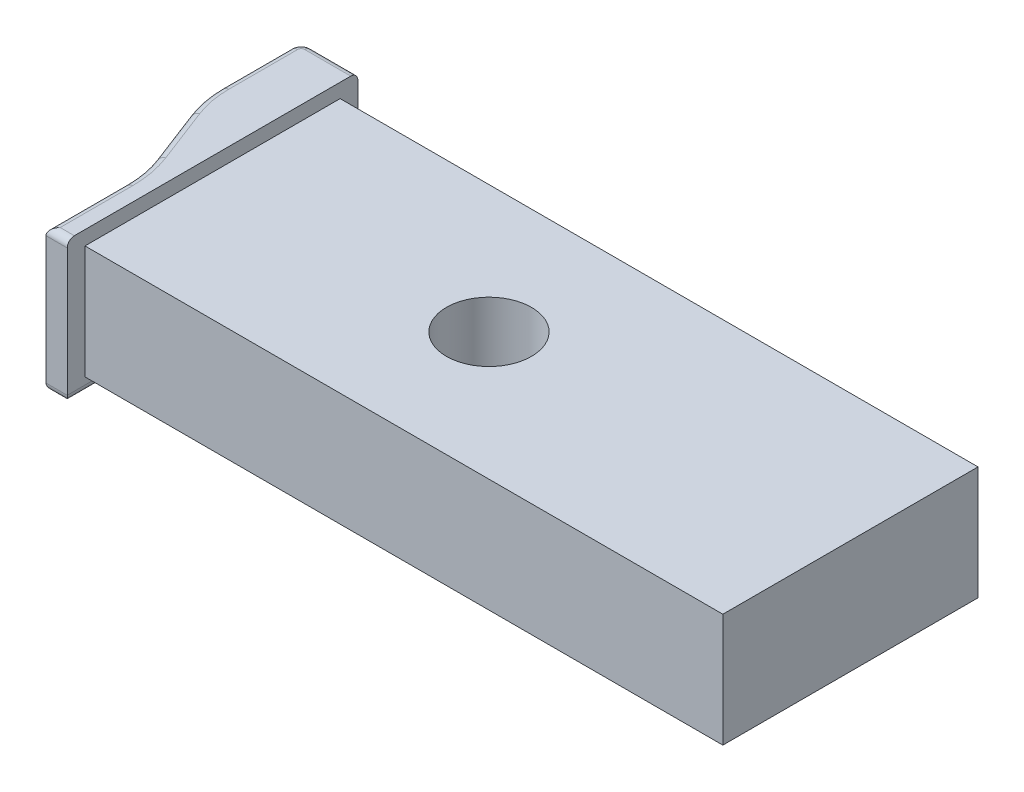
ISO-10303-21;
HEADER;
FILE_DESCRIPTION(('STEP AP214'),'2;1');
FILE_NAME('part.step','',(''),(''),'','','');
FILE_SCHEMA(('AUTOMOTIVE_DESIGN { 1 0 10303 214 1 1 1 1 }'));
ENDSEC;
DATA;
#1=APPLICATION_CONTEXT('core data for automotive mechanical design processes');
#2=APPLICATION_PROTOCOL_DEFINITION('international standard','automotive_design',2000,#1);
#3=PRODUCT_CONTEXT('',#1,'mechanical');
#4=PRODUCT('Part','Part','',(#3));
#5=PRODUCT_RELATED_PRODUCT_CATEGORY('part','',(#4));
#6=PRODUCT_DEFINITION_FORMATION('','',#4);
#7=PRODUCT_DEFINITION_CONTEXT('part definition',#1,'design');
#8=PRODUCT_DEFINITION('design','',#6,#7);
#9=PRODUCT_DEFINITION_SHAPE('','',#8);
#10=(LENGTH_UNIT() NAMED_UNIT(*) SI_UNIT(.MILLI.,.METRE.));
#11=(NAMED_UNIT(*) PLANE_ANGLE_UNIT() SI_UNIT($,.RADIAN.));
#12=(NAMED_UNIT(*) SI_UNIT($,.STERADIAN.) SOLID_ANGLE_UNIT());
#13=UNCERTAINTY_MEASURE_WITH_UNIT(LENGTH_MEASURE(1.E-05),#10,'distance_accuracy_value','');
#14=(GEOMETRIC_REPRESENTATION_CONTEXT(3) GLOBAL_UNCERTAINTY_ASSIGNED_CONTEXT((#13)) GLOBAL_UNIT_ASSIGNED_CONTEXT((#10,
#11,#12)) REPRESENTATION_CONTEXT('',''));
#15=CARTESIAN_POINT('',(0.,0.,0.));
#16=DIRECTION('',(0.,0.,1.));
#17=DIRECTION('',(1.,0.,0.));
#18=AXIS2_PLACEMENT_3D('',#15,#16,#17);
#19=CARTESIAN_POINT('',(0.,16.,0.));
#20=DIRECTION('',(0.,1.,0.));
#21=DIRECTION('',(0.,0.,1.));
#22=AXIS2_PLACEMENT_3D('',#19,#20,#21);
#23=PLANE('',#22);
#24=DIRECTION('',(0.,0.,-1.));
#25=VECTOR('',#24,1.);
#26=CARTESIAN_POINT('',(45.,16.,-18.));
#27=LINE('',#26,#25);
#28=CARTESIAN_POINT('',(45.,16.,18.));
#29=VERTEX_POINT('',#28);
#30=CARTESIAN_POINT('',(45.,16.,-18.));
#31=VERTEX_POINT('',#30);
#32=EDGE_CURVE('E219',#29,#31,#27,.T.);
#33=ORIENTED_EDGE('',*,*,#32,.T.);
#34=DIRECTION('',(-1.,0.,0.));
#35=VECTOR('',#34,1.);
#36=CARTESIAN_POINT('',(-45.,16.,-18.));
#37=LINE('',#36,#35);
#38=CARTESIAN_POINT('',(-45.,16.,-18.));
#39=VERTEX_POINT('',#38);
#40=EDGE_CURVE('E200',#31,#39,#37,.T.);
#41=ORIENTED_EDGE('',*,*,#40,.T.);
#42=DIRECTION('',(0.,0.,1.));
#43=VECTOR('',#42,1.);
#44=CARTESIAN_POINT('',(-45.,16.,-18.));
#45=LINE('',#44,#43);
#46=CARTESIAN_POINT('',(-45.,16.,18.));
#47=VERTEX_POINT('',#46);
#48=EDGE_CURVE('E185',#39,#47,#45,.T.);
#49=ORIENTED_EDGE('',*,*,#48,.T.);
#50=DIRECTION('',(1.,0.,0.));
#51=VECTOR('',#50,1.);
#52=CARTESIAN_POINT('',(-45.,16.,18.));
#53=LINE('',#52,#51);
#54=EDGE_CURVE('E198',#47,#29,#53,.T.);
#55=ORIENTED_EDGE('',*,*,#54,.T.);
#56=EDGE_LOOP('',(#33,#41,#49,#55));
#57=FACE_BOUND('',#56,.T.);
#58=CARTESIAN_POINT('',(-6.00000000000001,16.,0.));
#59=DIRECTION('',(0.,1.,0.));
#60=DIRECTION('',(0.,0.,1.));
#61=AXIS2_PLACEMENT_3D('',#58,#59,#60);
#62=CIRCLE('',#61,6.);
#63=CARTESIAN_POINT('',(-6.00000000000001,16.,6.));
#64=VERTEX_POINT('',#63);
#65=EDGE_CURVE('E214',#64,#64,#62,.T.);
#66=ORIENTED_EDGE('',*,*,#65,.F.);
#67=EDGE_LOOP('',(#66));
#68=FACE_BOUND('',#67,.T.);
#69=ADVANCED_FACE('F34',(#57,#68),#23,.T.);
#70=CARTESIAN_POINT('',(0.,0.,0.));
#71=DIRECTION('',(0.,1.,0.));
#72=DIRECTION('',(0.,0.,1.));
#73=AXIS2_PLACEMENT_3D('',#70,#71,#72);
#74=PLANE('',#73);
#75=DIRECTION('',(0.,0.,-1.));
#76=VECTOR('',#75,1.);
#77=CARTESIAN_POINT('',(45.,0.,-18.));
#78=LINE('',#77,#76);
#79=CARTESIAN_POINT('',(45.,0.,18.));
#80=VERTEX_POINT('',#79);
#81=CARTESIAN_POINT('',(45.,0.,-18.));
#82=VERTEX_POINT('',#81);
#83=EDGE_CURVE('E210',#80,#82,#78,.T.);
#84=ORIENTED_EDGE('',*,*,#83,.F.);
#85=DIRECTION('',(1.,0.,0.));
#86=VECTOR('',#85,1.);
#87=CARTESIAN_POINT('',(-45.,0.,18.));
#88=LINE('',#87,#86);
#89=CARTESIAN_POINT('',(-45.,0.,18.));
#90=VERTEX_POINT('',#89);
#91=EDGE_CURVE('E218',#90,#80,#88,.T.);
#92=ORIENTED_EDGE('',*,*,#91,.F.);
#93=DIRECTION('',(0.,0.,1.));
#94=VECTOR('',#93,1.);
#95=CARTESIAN_POINT('',(-45.,0.,-18.));
#96=LINE('',#95,#94);
#97=CARTESIAN_POINT('',(-45.,0.,-18.));
#98=VERTEX_POINT('',#97);
#99=EDGE_CURVE('E188',#98,#90,#96,.T.);
#100=ORIENTED_EDGE('',*,*,#99,.F.);
#101=DIRECTION('',(-1.,0.,0.));
#102=VECTOR('',#101,1.);
#103=CARTESIAN_POINT('',(-45.,0.,-18.));
#104=LINE('',#103,#102);
#105=EDGE_CURVE('E213',#82,#98,#104,.T.);
#106=ORIENTED_EDGE('',*,*,#105,.F.);
#107=EDGE_LOOP('',(#84,#92,#100,#106));
#108=FACE_BOUND('',#107,.T.);
#109=CARTESIAN_POINT('',(-6.00000000000001,0.,0.));
#110=DIRECTION('',(0.,1.,0.));
#111=DIRECTION('',(0.,0.,1.));
#112=AXIS2_PLACEMENT_3D('',#109,#110,#111);
#113=CIRCLE('',#112,6.);
#114=CARTESIAN_POINT('',(-6.00000000000001,0.,6.));
#115=VERTEX_POINT('',#114);
#116=EDGE_CURVE('E388',#115,#115,#113,.T.);
#117=ORIENTED_EDGE('',*,*,#116,.T.);
#118=EDGE_LOOP('',(#117));
#119=FACE_BOUND('',#118,.T.);
#120=ADVANCED_FACE('F399',(#108,#119),#74,.F.);
#121=CARTESIAN_POINT('',(45.,16.,-18.));
#122=DIRECTION('',(-1.,0.,0.));
#123=DIRECTION('',(0.,0.,1.));
#124=AXIS2_PLACEMENT_3D('',#121,#122,#123);
#125=PLANE('',#124);
#126=ORIENTED_EDGE('',*,*,#83,.T.);
#127=DIRECTION('',(0.,-1.,0.));
#128=VECTOR('',#127,1.);
#129=CARTESIAN_POINT('',(45.,16.,-18.));
#130=LINE('',#129,#128);
#131=EDGE_CURVE('E222',#31,#82,#130,.T.);
#132=ORIENTED_EDGE('',*,*,#131,.F.);
#133=ORIENTED_EDGE('',*,*,#32,.F.);
#134=DIRECTION('',(0.,-1.,0.));
#135=VECTOR('',#134,1.);
#136=CARTESIAN_POINT('',(45.,16.,18.));
#137=LINE('',#136,#135);
#138=EDGE_CURVE('E193',#29,#80,#137,.T.);
#139=ORIENTED_EDGE('',*,*,#138,.T.);
#140=EDGE_LOOP('',(#126,#132,#133,#139));
#141=FACE_BOUND('',#140,.T.);
#142=ADVANCED_FACE('F394',(#141),#125,.F.);
#143=CARTESIAN_POINT('',(-45.,16.,-18.));
#144=DIRECTION('',(0.,0.,1.));
#145=DIRECTION('',(1.,0.,0.));
#146=AXIS2_PLACEMENT_3D('',#143,#144,#145);
#147=PLANE('',#146);
#148=ORIENTED_EDGE('',*,*,#105,.T.);
#149=DIRECTION('',(0.,-1.,0.));
#150=VECTOR('',#149,1.);
#151=CARTESIAN_POINT('',(-45.,16.,-18.));
#152=LINE('',#151,#150);
#153=EDGE_CURVE('E192',#39,#98,#152,.T.);
#154=ORIENTED_EDGE('',*,*,#153,.F.);
#155=ORIENTED_EDGE('',*,*,#40,.F.);
#156=ORIENTED_EDGE('',*,*,#131,.T.);
#157=EDGE_LOOP('',(#148,#154,#155,#156));
#158=FACE_BOUND('',#157,.T.);
#159=ADVANCED_FACE('F397',(#158),#147,.F.);
#160=CARTESIAN_POINT('',(-45.,16.,18.));
#161=DIRECTION('',(0.,0.,-1.));
#162=DIRECTION('',(-1.,0.,0.));
#163=AXIS2_PLACEMENT_3D('',#160,#161,#162);
#164=PLANE('',#163);
#165=ORIENTED_EDGE('',*,*,#91,.T.);
#166=ORIENTED_EDGE('',*,*,#138,.F.);
#167=ORIENTED_EDGE('',*,*,#54,.F.);
#168=DIRECTION('',(0.,-1.,0.));
#169=VECTOR('',#168,1.);
#170=CARTESIAN_POINT('',(-45.,16.,18.));
#171=LINE('',#170,#169);
#172=EDGE_CURVE('E182',#47,#90,#171,.T.);
#173=ORIENTED_EDGE('',*,*,#172,.T.);
#174=EDGE_LOOP('',(#165,#166,#167,#173));
#175=FACE_BOUND('',#174,.T.);
#176=ADVANCED_FACE('F203',(#175),#164,.F.);
#177=CARTESIAN_POINT('',(-6.00000000000001,16.,0.));
#178=DIRECTION('',(0.,-1.,0.));
#179=DIRECTION('',(0.,0.,-1.));
#180=AXIS2_PLACEMENT_3D('',#177,#178,#179);
#181=CYLINDRICAL_SURFACE('',#180,6.);
#182=ORIENTED_EDGE('',*,*,#65,.T.);
#183=EDGE_LOOP('',(#182));
#184=FACE_BOUND('',#183,.T.);
#185=ORIENTED_EDGE('',*,*,#116,.F.);
#186=EDGE_LOOP('',(#185));
#187=FACE_BOUND('',#186,.T.);
#188=ADVANCED_FACE('F405',(#184,#187),#181,.F.);
#189=CARTESIAN_POINT('',(-45.,-2.,-20.5));
#190=DIRECTION('',(1.,0.,0.));
#191=DIRECTION('',(0.,0.,-1.));
#192=AXIS2_PLACEMENT_3D('',#189,#190,#191);
#193=PLANE('',#192);
#194=DIRECTION('',(0.,1.,0.));
#195=VECTOR('',#194,1.);
#196=CARTESIAN_POINT('',(-45.,-2.,20.5));
#197=LINE('',#196,#195);
#198=CARTESIAN_POINT('',(-45.,-0.999999999999998,20.5));
#199=VERTEX_POINT('',#198);
#200=CARTESIAN_POINT('',(-45.,17.,20.5));
#201=VERTEX_POINT('',#200);
#202=EDGE_CURVE('E721',#199,#201,#197,.T.);
#203=ORIENTED_EDGE('',*,*,#202,.F.);
#204=DIRECTION('',(0.,0.,-1.));
#205=VECTOR('',#204,1.);
#206=CARTESIAN_POINT('',(-45.,-0.999999999999998,-20.5));
#207=LINE('',#206,#205);
#208=CARTESIAN_POINT('',(-45.,-0.999999999999998,-20.5));
#209=VERTEX_POINT('',#208);
#210=EDGE_CURVE('E271',#199,#209,#207,.T.);
#211=ORIENTED_EDGE('',*,*,#210,.T.);
#212=DIRECTION('',(0.,1.,0.));
#213=VECTOR('',#212,1.);
#214=CARTESIAN_POINT('',(-45.,-2.,-20.5));
#215=LINE('',#214,#213);
#216=CARTESIAN_POINT('',(-45.,17.,-20.5));
#217=VERTEX_POINT('',#216);
#218=EDGE_CURVE('E391',#209,#217,#215,.T.);
#219=ORIENTED_EDGE('',*,*,#218,.T.);
#220=CARTESIAN_POINT('',(-45.,17.,-19.5));
#221=DIRECTION('',(1.,0.,0.));
#222=DIRECTION('',(0.,0.,-1.));
#223=AXIS2_PLACEMENT_3D('',#220,#221,#222);
#224=CIRCLE('',#223,1.);
#225=CARTESIAN_POINT('',(-45.,18.,-19.5));
#226=VERTEX_POINT('',#225);
#227=EDGE_CURVE('E242',#217,#226,#224,.T.);
#228=ORIENTED_EDGE('',*,*,#227,.T.);
#229=DIRECTION('',(0.,0.,-1.));
#230=VECTOR('',#229,1.);
#231=CARTESIAN_POINT('',(-45.,18.,-20.5));
#232=LINE('',#231,#230);
#233=CARTESIAN_POINT('',(-45.,18.,19.5));
#234=VERTEX_POINT('',#233);
#235=EDGE_CURVE('E293',#234,#226,#232,.T.);
#236=ORIENTED_EDGE('',*,*,#235,.F.);
#237=CARTESIAN_POINT('',(-45.,17.,19.5));
#238=DIRECTION('',(1.,0.,0.));
#239=DIRECTION('',(0.,0.,-1.));
#240=AXIS2_PLACEMENT_3D('',#237,#238,#239);
#241=CIRCLE('',#240,1.);
#242=EDGE_CURVE('E244',#234,#201,#241,.T.);
#243=ORIENTED_EDGE('',*,*,#242,.T.);
#244=EDGE_LOOP('',(#203,#211,#219,#228,#236,#243));
#245=FACE_BOUND('',#244,.T.);
#246=ORIENTED_EDGE('',*,*,#153,.T.);
#247=ORIENTED_EDGE('',*,*,#99,.T.);
#248=ORIENTED_EDGE('',*,*,#172,.F.);
#249=ORIENTED_EDGE('',*,*,#48,.F.);
#250=EDGE_LOOP('',(#246,#247,#248,#249));
#251=FACE_BOUND('',#250,.T.);
#252=ADVANCED_FACE('F184',(#245,#251),#193,.T.);
#253=CARTESIAN_POINT('',(-45.,-2.,-20.5));
#254=DIRECTION('',(0.,0.,-1.));
#255=DIRECTION('',(-1.,0.,0.));
#256=AXIS2_PLACEMENT_3D('',#253,#254,#255);
#257=PLANE('',#256);
#258=ORIENTED_EDGE('',*,*,#218,.F.);
#259=DIRECTION('',(-1.,0.,0.));
#260=VECTOR('',#259,1.);
#261=CARTESIAN_POINT('',(-45.,-0.999999999999998,-20.5));
#262=LINE('',#261,#260);
#263=CARTESIAN_POINT('',(-51.5,-0.999999999999998,-20.5));
#264=VERTEX_POINT('',#263);
#265=EDGE_CURVE('E11',#209,#264,#262,.T.);
#266=ORIENTED_EDGE('',*,*,#265,.T.);
#267=DIRECTION('',(0.,1.,0.));
#268=VECTOR('',#267,1.);
#269=CARTESIAN_POINT('',(-51.5,-2.,-20.5));
#270=LINE('',#269,#268);
#271=CARTESIAN_POINT('',(-51.5,17.,-20.5));
#272=VERTEX_POINT('',#271);
#273=EDGE_CURVE('E384',#264,#272,#270,.T.);
#274=ORIENTED_EDGE('',*,*,#273,.T.);
#275=DIRECTION('',(-1.,0.,0.));
#276=VECTOR('',#275,1.);
#277=CARTESIAN_POINT('',(-45.,17.,-20.5));
#278=LINE('',#277,#276);
#279=EDGE_CURVE('E268',#272,#217,#278,.F.);
#280=ORIENTED_EDGE('',*,*,#279,.T.);
#281=EDGE_LOOP('',(#258,#266,#274,#280));
#282=FACE_BOUND('',#281,.T.);
#283=ADVANCED_FACE('F413',(#282),#257,.T.);
#284=CARTESIAN_POINT('',(-45.,-2.,20.5));
#285=DIRECTION('',(0.,0.,1.));
#286=DIRECTION('',(1.,0.,0.));
#287=AXIS2_PLACEMENT_3D('',#284,#285,#286);
#288=PLANE('',#287);
#289=DIRECTION('',(0.,1.,0.));
#290=VECTOR('',#289,1.);
#291=CARTESIAN_POINT('',(-48.,-2.,20.5));
#292=LINE('',#291,#290);
#293=CARTESIAN_POINT('',(-48.,-0.999999999999998,20.5));
#294=VERTEX_POINT('',#293);
#295=CARTESIAN_POINT('',(-48.,17.,20.5));
#296=VERTEX_POINT('',#295);
#297=EDGE_CURVE('E375',#294,#296,#292,.T.);
#298=ORIENTED_EDGE('',*,*,#297,.F.);
#299=DIRECTION('',(1.,0.,0.));
#300=VECTOR('',#299,1.);
#301=CARTESIAN_POINT('',(-45.,-0.999999999999998,20.5));
#302=LINE('',#301,#300);
#303=EDGE_CURVE('E315',#294,#199,#302,.T.);
#304=ORIENTED_EDGE('',*,*,#303,.T.);
#305=ORIENTED_EDGE('',*,*,#202,.T.);
#306=DIRECTION('',(1.,0.,0.));
#307=VECTOR('',#306,1.);
#308=CARTESIAN_POINT('',(-48.,17.,20.5));
#309=LINE('',#308,#307);
#310=EDGE_CURVE('E247',#201,#296,#309,.F.);
#311=ORIENTED_EDGE('',*,*,#310,.T.);
#312=EDGE_LOOP('',(#298,#304,#305,#311));
#313=FACE_BOUND('',#312,.T.);
#314=ADVANCED_FACE('F583',(#313),#288,.T.);
#315=CARTESIAN_POINT('',(-48.,-2.,20.5));
#316=DIRECTION('',(-1.,0.,0.));
#317=DIRECTION('',(0.,0.,1.));
#318=AXIS2_PLACEMENT_3D('',#315,#316,#317);
#319=PLANE('',#318);
#320=DIRECTION('',(0.,1.,0.));
#321=VECTOR('',#320,1.);
#322=CARTESIAN_POINT('',(-48.,-2.,9.28516483155242));
#323=LINE('',#322,#321);
#324=CARTESIAN_POINT('',(-48.,-0.999999999999998,9.28516483155242));
#325=VERTEX_POINT('',#324);
#326=CARTESIAN_POINT('',(-48.,17.,9.28516483155242));
#327=VERTEX_POINT('',#326);
#328=EDGE_CURVE('E373',#325,#327,#323,.T.);
#329=ORIENTED_EDGE('',*,*,#328,.F.);
#330=DIRECTION('',(0.,0.,1.));
#331=VECTOR('',#330,1.);
#332=CARTESIAN_POINT('',(-48.,-0.999999999999998,20.5));
#333=LINE('',#332,#331);
#334=EDGE_CURVE('E317',#325,#294,#333,.T.);
#335=ORIENTED_EDGE('',*,*,#334,.T.);
#336=ORIENTED_EDGE('',*,*,#297,.T.);
#337=DIRECTION('',(0.,0.,1.));
#338=VECTOR('',#337,1.);
#339=CARTESIAN_POINT('',(-48.,17.,9.28516483155242));
#340=LINE('',#339,#338);
#341=EDGE_CURVE('E250',#296,#327,#340,.F.);
#342=ORIENTED_EDGE('',*,*,#341,.T.);
#343=EDGE_LOOP('',(#329,#335,#336,#342));
#344=FACE_BOUND('',#343,.T.);
#345=ADVANCED_FACE('F576',(#344),#319,.T.);
#346=CARTESIAN_POINT('',(-63.,-2.,9.28516483155236));
#347=DIRECTION('',(0.,1.,0.));
#348=DIRECTION('',(0.,0.,1.));
#349=AXIS2_PLACEMENT_3D('',#346,#347,#348);
#350=CYLINDRICAL_SURFACE('',#349,15.);
#351=DIRECTION('',(0.,1.,0.));
#352=VECTOR('',#351,1.);
#353=CARTESIAN_POINT('',(-48.9998159069541,-2.,3.90047864191927));
#354=LINE('',#353,#352);
#355=CARTESIAN_POINT('',(-48.9998159069541,-0.999999999999998,3.90047864191927));
#356=VERTEX_POINT('',#355);
#357=CARTESIAN_POINT('',(-48.9998159069541,17.,3.90047864191927));
#358=VERTEX_POINT('',#357);
#359=EDGE_CURVE('E366',#356,#358,#354,.T.);
#360=ORIENTED_EDGE('',*,*,#359,.F.);
#361=CARTESIAN_POINT('',(-63.,-0.999999999999998,9.28516483155236));
#362=DIRECTION('',(0.,-1.,0.));
#363=DIRECTION('',(0.,0.,-1.));
#364=AXIS2_PLACEMENT_3D('',#361,#362,#363);
#365=CIRCLE('',#364,15.);
#366=EDGE_CURVE('E319',#356,#325,#365,.T.);
#367=ORIENTED_EDGE('',*,*,#366,.T.);
#368=ORIENTED_EDGE('',*,*,#328,.T.);
#369=CARTESIAN_POINT('',(-63.,17.,9.28516483155236));
#370=DIRECTION('',(0.,-1.,0.));
#371=DIRECTION('',(0.,0.,-1.));
#372=AXIS2_PLACEMENT_3D('',#369,#370,#371);
#373=CIRCLE('',#372,15.);
#374=EDGE_CURVE('E253',#327,#358,#373,.F.);
#375=ORIENTED_EDGE('',*,*,#374,.T.);
#376=EDGE_LOOP('',(#360,#367,#368,#375));
#377=FACE_BOUND('',#376,.T.);
#378=ADVANCED_FACE('F369',(#377),#350,.F.);
#379=CARTESIAN_POINT('',(-52.0001840930459,-2.,-3.90047864191927));
#380=DIRECTION('',(-0.93334560620306,0.,0.358979079308869));
#381=DIRECTION('',(0.358979079308869,0.,0.93334560620306));
#382=AXIS2_PLACEMENT_3D('',#379,#380,#381);
#383=PLANE('',#382);
#384=DIRECTION('',(0.,1.,0.));
#385=VECTOR('',#384,1.);
#386=CARTESIAN_POINT('',(-52.0001840930459,-2.,-3.90047864191927));
#387=LINE('',#386,#385);
#388=CARTESIAN_POINT('',(-52.0001840930459,-0.999999999999998,-3.90047864191927));
#389=VERTEX_POINT('',#388);
#390=CARTESIAN_POINT('',(-52.0001840930459,17.,-3.90047864191927));
#391=VERTEX_POINT('',#390);
#392=EDGE_CURVE('E367',#389,#391,#387,.T.);
#393=ORIENTED_EDGE('',*,*,#392,.F.);
#394=DIRECTION('',(0.358979079308869,0.,0.93334560620306));
#395=VECTOR('',#394,1.);
#396=CARTESIAN_POINT('',(-52.0001840930459,-0.999999999999998,-3.90047864191927));
#397=LINE('',#396,#395);
#398=EDGE_CURVE('E321',#389,#356,#397,.T.);
#399=ORIENTED_EDGE('',*,*,#398,.T.);
#400=ORIENTED_EDGE('',*,*,#359,.T.);
#401=DIRECTION('',(0.358979079308869,0.,0.93334560620306));
#402=VECTOR('',#401,1.);
#403=CARTESIAN_POINT('',(-52.0001840930459,17.,-3.90047864191927));
#404=LINE('',#403,#402);
#405=EDGE_CURVE('E256',#358,#391,#404,.F.);
#406=ORIENTED_EDGE('',*,*,#405,.T.);
#407=EDGE_LOOP('',(#393,#399,#400,#406));
#408=FACE_BOUND('',#407,.T.);
#409=ADVANCED_FACE('F365',(#408),#383,.T.);
#410=CARTESIAN_POINT('',(-38.,-2.,-9.28516483155236));
#411=DIRECTION('',(0.,1.,0.));
#412=DIRECTION('',(0.,0.,1.));
#413=AXIS2_PLACEMENT_3D('',#410,#411,#412);
#414=CYLINDRICAL_SURFACE('',#413,15.);
#415=DIRECTION('',(0.,1.,0.));
#416=VECTOR('',#415,1.);
#417=CARTESIAN_POINT('',(-53.,-2.,-9.28516483155241));
#418=LINE('',#417,#416);
#419=CARTESIAN_POINT('',(-53.,-0.999999999999998,-9.28516483155241));
#420=VERTEX_POINT('',#419);
#421=CARTESIAN_POINT('',(-53.,17.,-9.28516483155241));
#422=VERTEX_POINT('',#421);
#423=EDGE_CURVE('E377',#420,#422,#418,.T.);
#424=ORIENTED_EDGE('',*,*,#423,.F.);
#425=CARTESIAN_POINT('',(-38.,-0.999999999999998,-9.28516483155236));
#426=DIRECTION('',(0.,-1.,0.));
#427=DIRECTION('',(0.,0.,-1.));
#428=AXIS2_PLACEMENT_3D('',#425,#426,#427);
#429=CIRCLE('',#428,15.);
#430=EDGE_CURVE('E323',#420,#389,#429,.F.);
#431=ORIENTED_EDGE('',*,*,#430,.T.);
#432=ORIENTED_EDGE('',*,*,#392,.T.);
#433=CARTESIAN_POINT('',(-38.,17.,-9.28516483155236));
#434=DIRECTION('',(0.,-1.,0.));
#435=DIRECTION('',(0.,0.,-1.));
#436=AXIS2_PLACEMENT_3D('',#433,#434,#435);
#437=CIRCLE('',#436,15.);
#438=EDGE_CURVE('E259',#391,#422,#437,.T.);
#439=ORIENTED_EDGE('',*,*,#438,.T.);
#440=EDGE_LOOP('',(#424,#431,#432,#439));
#441=FACE_BOUND('',#440,.T.);
#442=ADVANCED_FACE('F555',(#441),#414,.T.);
#443=CARTESIAN_POINT('',(-53.,-2.,-19.));
#444=DIRECTION('',(-1.,0.,0.));
#445=DIRECTION('',(0.,0.,1.));
#446=AXIS2_PLACEMENT_3D('',#443,#444,#445);
#447=PLANE('',#446);
#448=DIRECTION('',(0.,1.,0.));
#449=VECTOR('',#448,1.);
#450=CARTESIAN_POINT('',(-53.,-2.,-19.));
#451=LINE('',#450,#449);
#452=CARTESIAN_POINT('',(-53.,-0.999999999999998,-19.));
#453=VERTEX_POINT('',#452);
#454=CARTESIAN_POINT('',(-53.,17.,-19.));
#455=VERTEX_POINT('',#454);
#456=EDGE_CURVE('E382',#453,#455,#451,.T.);
#457=ORIENTED_EDGE('',*,*,#456,.F.);
#458=DIRECTION('',(0.,0.,1.));
#459=VECTOR('',#458,1.);
#460=CARTESIAN_POINT('',(-53.,-0.999999999999998,-19.));
#461=LINE('',#460,#459);
#462=EDGE_CURVE('E325',#453,#420,#461,.T.);
#463=ORIENTED_EDGE('',*,*,#462,.T.);
#464=ORIENTED_EDGE('',*,*,#423,.T.);
#465=DIRECTION('',(0.,0.,1.));
#466=VECTOR('',#465,1.);
#467=CARTESIAN_POINT('',(-53.,17.,-19.));
#468=LINE('',#467,#466);
#469=EDGE_CURVE('E262',#422,#455,#468,.F.);
#470=ORIENTED_EDGE('',*,*,#469,.T.);
#471=EDGE_LOOP('',(#457,#463,#464,#470));
#472=FACE_BOUND('',#471,.T.);
#473=ADVANCED_FACE('F548',(#472),#447,.T.);
#474=CARTESIAN_POINT('',(-51.5,-2.,-19.));
#475=DIRECTION('',(0.,1.,0.));
#476=DIRECTION('',(0.,0.,1.));
#477=AXIS2_PLACEMENT_3D('',#474,#475,#476);
#478=CYLINDRICAL_SURFACE('',#477,1.5);
#479=ORIENTED_EDGE('',*,*,#273,.F.);
#480=CARTESIAN_POINT('',(-51.5,-0.999999999999998,-19.));
#481=DIRECTION('',(0.,-1.,0.));
#482=DIRECTION('',(0.,0.,-1.));
#483=AXIS2_PLACEMENT_3D('',#480,#481,#482);
#484=CIRCLE('',#483,1.5);
#485=EDGE_CURVE('E43',#264,#453,#484,.F.);
#486=ORIENTED_EDGE('',*,*,#485,.T.);
#487=ORIENTED_EDGE('',*,*,#456,.T.);
#488=CARTESIAN_POINT('',(-51.5,17.,-19.));
#489=DIRECTION('',(0.,-1.,0.));
#490=DIRECTION('',(0.,0.,-1.));
#491=AXIS2_PLACEMENT_3D('',#488,#489,#490);
#492=CIRCLE('',#491,1.5);
#493=EDGE_CURVE('E265',#455,#272,#492,.T.);
#494=ORIENTED_EDGE('',*,*,#493,.T.);
#495=EDGE_LOOP('',(#479,#486,#487,#494));
#496=FACE_BOUND('',#495,.T.);
#497=ADVANCED_FACE('F540',(#496),#478,.T.);
#498=CARTESIAN_POINT('',(-51.5,-2.,-19.));
#499=DIRECTION('',(0.,-1.,0.));
#500=DIRECTION('',(0.,0.,-1.));
#501=AXIS2_PLACEMENT_3D('',#498,#499,#500);
#502=PLANE('',#501);
#503=DIRECTION('',(-1.,0.,0.));
#504=VECTOR('',#503,1.);
#505=CARTESIAN_POINT('',(-51.5,-2.,-19.5));
#506=LINE('',#505,#504);
#507=CARTESIAN_POINT('',(-51.5,-2.,-19.5));
#508=VERTEX_POINT('',#507);
#509=CARTESIAN_POINT('',(-46.,-2.,-19.5));
#510=VERTEX_POINT('',#509);
#511=EDGE_CURVE('E296',#508,#510,#506,.F.);
#512=ORIENTED_EDGE('',*,*,#511,.T.);
#513=DIRECTION('',(0.,0.,-1.));
#514=VECTOR('',#513,1.);
#515=CARTESIAN_POINT('',(-46.,-2.,-19.));
#516=LINE('',#515,#514);
#517=CARTESIAN_POINT('',(-46.,-2.,19.5));
#518=VERTEX_POINT('',#517);
#519=EDGE_CURVE('E312',#510,#518,#516,.F.);
#520=ORIENTED_EDGE('',*,*,#519,.T.);
#521=DIRECTION('',(1.,0.,0.));
#522=VECTOR('',#521,1.);
#523=CARTESIAN_POINT('',(-51.5,-2.,19.5));
#524=LINE('',#523,#522);
#525=CARTESIAN_POINT('',(-47.,-2.,19.5));
#526=VERTEX_POINT('',#525);
#527=EDGE_CURVE('E310',#518,#526,#524,.F.);
#528=ORIENTED_EDGE('',*,*,#527,.T.);
#529=DIRECTION('',(0.,0.,1.));
#530=VECTOR('',#529,1.);
#531=CARTESIAN_POINT('',(-47.,-2.,-19.));
#532=LINE('',#531,#530);
#533=CARTESIAN_POINT('',(-47.,-2.,9.28516483155242));
#534=VERTEX_POINT('',#533);
#535=EDGE_CURVE('E308',#526,#534,#532,.F.);
#536=ORIENTED_EDGE('',*,*,#535,.T.);
#537=CARTESIAN_POINT('',(-63.,-2.,9.28516483155236));
#538=DIRECTION('',(0.,-1.,0.));
#539=DIRECTION('',(0.,0.,-1.));
#540=AXIS2_PLACEMENT_3D('',#537,#538,#539);
#541=CIRCLE('',#540,16.);
#542=CARTESIAN_POINT('',(-48.0664703007511,-2.,3.5414995626104));
#543=VERTEX_POINT('',#542);
#544=EDGE_CURVE('E306',#534,#543,#541,.F.);
#545=ORIENTED_EDGE('',*,*,#544,.T.);
#546=DIRECTION('',(0.358979079308869,0.,0.93334560620306));
#547=VECTOR('',#546,1.);
#548=CARTESIAN_POINT('',(-56.0614997546217,-2.,-17.2455770174532));
#549=LINE('',#548,#547);
#550=CARTESIAN_POINT('',(-51.0668384868428,-2.,-4.25945772122814));
#551=VERTEX_POINT('',#550);
#552=EDGE_CURVE('E304',#543,#551,#549,.F.);
#553=ORIENTED_EDGE('',*,*,#552,.T.);
#554=CARTESIAN_POINT('',(-38.,-2.,-9.28516483155236));
#555=DIRECTION('',(0.,-1.,0.));
#556=DIRECTION('',(0.,0.,-1.));
#557=AXIS2_PLACEMENT_3D('',#554,#555,#556);
#558=CIRCLE('',#557,14.);
#559=CARTESIAN_POINT('',(-52.,-2.,-9.28516483155241));
#560=VERTEX_POINT('',#559);
#561=EDGE_CURVE('E302',#551,#560,#558,.T.);
#562=ORIENTED_EDGE('',*,*,#561,.T.);
#563=DIRECTION('',(0.,0.,1.));
#564=VECTOR('',#563,1.);
#565=CARTESIAN_POINT('',(-52.,-2.,-19.));
#566=LINE('',#565,#564);
#567=CARTESIAN_POINT('',(-52.,-2.,-19.));
#568=VERTEX_POINT('',#567);
#569=EDGE_CURVE('E300',#560,#568,#566,.F.);
#570=ORIENTED_EDGE('',*,*,#569,.T.);
#571=CARTESIAN_POINT('',(-51.5,-2.,-19.));
#572=DIRECTION('',(0.,-1.,0.));
#573=DIRECTION('',(0.,0.,-1.));
#574=AXIS2_PLACEMENT_3D('',#571,#572,#573);
#575=CIRCLE('',#574,0.500000000000001);
#576=EDGE_CURVE('E298',#568,#508,#575,.T.);
#577=ORIENTED_EDGE('',*,*,#576,.T.);
#578=EDGE_LOOP('',(#512,#520,#528,#536,#545,#553,#562,#570,#577));
#579=FACE_BOUND('',#578,.T.);
#580=ADVANCED_FACE('F532',(#579),#502,.T.);
#581=CARTESIAN_POINT('',(-51.5,18.,-19.));
#582=DIRECTION('',(0.,-1.,0.));
#583=DIRECTION('',(0.,0.,-1.));
#584=AXIS2_PLACEMENT_3D('',#581,#582,#583);
#585=PLANE('',#584);
#586=DIRECTION('',(0.,0.,1.));
#587=VECTOR('',#586,1.);
#588=CARTESIAN_POINT('',(-47.,18.,20.5));
#589=LINE('',#588,#587);
#590=CARTESIAN_POINT('',(-47.,18.,9.28516483155242));
#591=VERTEX_POINT('',#590);
#592=CARTESIAN_POINT('',(-47.,18.,19.5));
#593=VERTEX_POINT('',#592);
#594=EDGE_CURVE('E237',#591,#593,#589,.T.);
#595=ORIENTED_EDGE('',*,*,#594,.T.);
#596=DIRECTION('',(1.,0.,0.));
#597=VECTOR('',#596,1.);
#598=CARTESIAN_POINT('',(-45.,18.,19.5));
#599=LINE('',#598,#597);
#600=EDGE_CURVE('E239',#593,#234,#599,.T.);
#601=ORIENTED_EDGE('',*,*,#600,.T.);
#602=ORIENTED_EDGE('',*,*,#235,.T.);
#603=DIRECTION('',(-1.,0.,0.));
#604=VECTOR('',#603,1.);
#605=CARTESIAN_POINT('',(-51.5,18.,-19.5));
#606=LINE('',#605,#604);
#607=CARTESIAN_POINT('',(-51.5,18.,-19.5));
#608=VERTEX_POINT('',#607);
#609=EDGE_CURVE('E225',#226,#608,#606,.T.);
#610=ORIENTED_EDGE('',*,*,#609,.T.);
#611=CARTESIAN_POINT('',(-51.5,18.,-19.));
#612=DIRECTION('',(0.,-1.,0.));
#613=DIRECTION('',(0.,0.,-1.));
#614=AXIS2_PLACEMENT_3D('',#611,#612,#613);
#615=CIRCLE('',#614,0.500000000000001);
#616=CARTESIAN_POINT('',(-52.,18.,-19.));
#617=VERTEX_POINT('',#616);
#618=EDGE_CURVE('E227',#608,#617,#615,.F.);
#619=ORIENTED_EDGE('',*,*,#618,.T.);
#620=DIRECTION('',(0.,0.,1.));
#621=VECTOR('',#620,1.);
#622=CARTESIAN_POINT('',(-52.,18.,-9.28516483155241));
#623=LINE('',#622,#621);
#624=CARTESIAN_POINT('',(-52.,18.,-9.28516483155241));
#625=VERTEX_POINT('',#624);
#626=EDGE_CURVE('E229',#617,#625,#623,.T.);
#627=ORIENTED_EDGE('',*,*,#626,.T.);
#628=CARTESIAN_POINT('',(-38.,18.,-9.28516483155236));
#629=DIRECTION('',(0.,-1.,0.));
#630=DIRECTION('',(0.,0.,-1.));
#631=AXIS2_PLACEMENT_3D('',#628,#629,#630);
#632=CIRCLE('',#631,14.);
#633=CARTESIAN_POINT('',(-51.0668384868428,18.,-4.25945772122814));
#634=VERTEX_POINT('',#633);
#635=EDGE_CURVE('E231',#625,#634,#632,.F.);
#636=ORIENTED_EDGE('',*,*,#635,.T.);
#637=DIRECTION('',(0.358979079308869,0.,0.93334560620306));
#638=VECTOR('',#637,1.);
#639=CARTESIAN_POINT('',(-48.066470300751,18.,3.54149956261041));
#640=LINE('',#639,#638);
#641=CARTESIAN_POINT('',(-48.0664703007511,18.,3.54149956261039));
#642=VERTEX_POINT('',#641);
#643=EDGE_CURVE('E233',#634,#642,#640,.T.);
#644=ORIENTED_EDGE('',*,*,#643,.T.);
#645=CARTESIAN_POINT('',(-63.,18.,9.28516483155236));
#646=DIRECTION('',(0.,-1.,0.));
#647=DIRECTION('',(0.,0.,-1.));
#648=AXIS2_PLACEMENT_3D('',#645,#646,#647);
#649=CIRCLE('',#648,16.);
#650=EDGE_CURVE('E235',#642,#591,#649,.T.);
#651=ORIENTED_EDGE('',*,*,#650,.T.);
#652=EDGE_LOOP('',(#595,#601,#602,#610,#619,#627,#636,#644,#651));
#653=FACE_BOUND('',#652,.T.);
#654=ADVANCED_FACE('F458',(#653),#585,.F.);
#655=CARTESIAN_POINT('',(-51.5,17.,-19.5));
#656=DIRECTION('',(1.,0.,0.));
#657=DIRECTION('',(0.,0.,-1.));
#658=AXIS2_PLACEMENT_3D('',#655,#656,#657);
#659=CYLINDRICAL_SURFACE('',#658,1.);
#660=ORIENTED_EDGE('',*,*,#227,.F.);
#661=ORIENTED_EDGE('',*,*,#279,.F.);
#662=CARTESIAN_POINT('',(-51.5,17.,-19.5));
#663=DIRECTION('',(-1.,0.,0.));
#664=DIRECTION('',(0.,0.,1.));
#665=AXIS2_PLACEMENT_3D('',#662,#663,#664);
#666=CIRCLE('',#665,1.);
#667=EDGE_CURVE('E290',#608,#272,#666,.T.);
#668=ORIENTED_EDGE('',*,*,#667,.F.);
#669=ORIENTED_EDGE('',*,*,#609,.F.);
#670=EDGE_LOOP('',(#660,#661,#668,#669));
#671=FACE_BOUND('',#670,.T.);
#672=ADVANCED_FACE('F454',(#671),#659,.T.);
#673=CARTESIAN_POINT('',(-51.5,17.,-19.));
#674=DIRECTION('',(0.,-1.,0.));
#675=DIRECTION('',(0.,0.,-1.));
#676=AXIS2_PLACEMENT_3D('',#673,#674,#675);
#677=DEGENERATE_TOROIDAL_SURFACE('',#676,0.500000000000001,1.,.T.);
#678=ORIENTED_EDGE('',*,*,#667,.T.);
#679=ORIENTED_EDGE('',*,*,#493,.F.);
#680=CARTESIAN_POINT('',(-52.,17.,-19.));
#681=DIRECTION('',(0.,0.,1.));
#682=DIRECTION('',(1.,0.,0.));
#683=AXIS2_PLACEMENT_3D('',#680,#681,#682);
#684=CIRCLE('',#683,1.);
#685=EDGE_CURVE('E287',#617,#455,#684,.T.);
#686=ORIENTED_EDGE('',*,*,#685,.F.);
#687=ORIENTED_EDGE('',*,*,#618,.F.);
#688=EDGE_LOOP('',(#678,#679,#686,#687));
#689=FACE_BOUND('',#688,.T.);
#690=ADVANCED_FACE('F450',(#689),#677,.T.);
#691=CARTESIAN_POINT('',(-52.,17.,-19.));
#692=DIRECTION('',(0.,0.,-1.));
#693=DIRECTION('',(-1.,0.,0.));
#694=AXIS2_PLACEMENT_3D('',#691,#692,#693);
#695=CYLINDRICAL_SURFACE('',#694,1.);
#696=ORIENTED_EDGE('',*,*,#685,.T.);
#697=ORIENTED_EDGE('',*,*,#469,.F.);
#698=CARTESIAN_POINT('',(-52.,17.,-9.28516483155241));
#699=DIRECTION('',(0.,0.,1.));
#700=DIRECTION('',(1.,0.,0.));
#701=AXIS2_PLACEMENT_3D('',#698,#699,#700);
#702=CIRCLE('',#701,1.);
#703=EDGE_CURVE('E284',#625,#422,#702,.T.);
#704=ORIENTED_EDGE('',*,*,#703,.F.);
#705=ORIENTED_EDGE('',*,*,#626,.F.);
#706=EDGE_LOOP('',(#696,#697,#704,#705));
#707=FACE_BOUND('',#706,.T.);
#708=ADVANCED_FACE('F446',(#707),#695,.T.);
#709=CARTESIAN_POINT('',(-38.,17.,-9.28516483155236));
#710=DIRECTION('',(0.,-1.,0.));
#711=DIRECTION('',(0.,0.,-1.));
#712=AXIS2_PLACEMENT_3D('',#709,#710,#711);
#713=TOROIDAL_SURFACE('',#712,14.,1.);
#714=ORIENTED_EDGE('',*,*,#703,.T.);
#715=ORIENTED_EDGE('',*,*,#438,.F.);
#716=CARTESIAN_POINT('',(-51.0668384868428,17.,-4.25945772122814));
#717=DIRECTION('',(0.358979079308869,0.,0.93334560620306));
#718=DIRECTION('',(0.93334560620306,0.,-0.358979079308869));
#719=AXIS2_PLACEMENT_3D('',#716,#717,#718);
#720=CIRCLE('',#719,1.);
#721=EDGE_CURVE('E281',#634,#391,#720,.T.);
#722=ORIENTED_EDGE('',*,*,#721,.F.);
#723=ORIENTED_EDGE('',*,*,#635,.F.);
#724=EDGE_LOOP('',(#714,#715,#722,#723));
#725=FACE_BOUND('',#724,.T.);
#726=ADVANCED_FACE('F442',(#725),#713,.T.);
#727=CARTESIAN_POINT('',(-56.0614997546217,17.,-17.2455770174532));
#728=DIRECTION('',(-0.358979079308869,0.,-0.93334560620306));
#729=DIRECTION('',(-0.93334560620306,0.,0.358979079308869));
#730=AXIS2_PLACEMENT_3D('',#727,#728,#729);
#731=CYLINDRICAL_SURFACE('',#730,1.);
#732=ORIENTED_EDGE('',*,*,#721,.T.);
#733=ORIENTED_EDGE('',*,*,#405,.F.);
#734=CARTESIAN_POINT('',(-48.0664703007511,17.,3.54149956261039));
#735=DIRECTION('',(0.358979079308874,0.,0.933345606203058));
#736=DIRECTION('',(0.933345606203058,0.,-0.358979079308874));
#737=AXIS2_PLACEMENT_3D('',#734,#735,#736);
#738=CIRCLE('',#737,1.);
#739=EDGE_CURVE('E278',#642,#358,#738,.T.);
#740=ORIENTED_EDGE('',*,*,#739,.F.);
#741=ORIENTED_EDGE('',*,*,#643,.F.);
#742=EDGE_LOOP('',(#732,#733,#740,#741));
#743=FACE_BOUND('',#742,.T.);
#744=ADVANCED_FACE('F438',(#743),#731,.T.);
#745=CARTESIAN_POINT('',(-63.,17.,9.28516483155236));
#746=DIRECTION('',(0.,-1.,0.));
#747=DIRECTION('',(0.,0.,-1.));
#748=AXIS2_PLACEMENT_3D('',#745,#746,#747);
#749=TOROIDAL_SURFACE('',#748,16.,1.);
#750=ORIENTED_EDGE('',*,*,#739,.T.);
#751=ORIENTED_EDGE('',*,*,#374,.F.);
#752=CARTESIAN_POINT('',(-47.,17.,9.28516483155242));
#753=DIRECTION('',(0.,0.,1.));
#754=DIRECTION('',(1.,0.,0.));
#755=AXIS2_PLACEMENT_3D('',#752,#753,#754);
#756=CIRCLE('',#755,1.);
#757=EDGE_CURVE('E275',#591,#327,#756,.T.);
#758=ORIENTED_EDGE('',*,*,#757,.F.);
#759=ORIENTED_EDGE('',*,*,#650,.F.);
#760=EDGE_LOOP('',(#750,#751,#758,#759));
#761=FACE_BOUND('',#760,.T.);
#762=ADVANCED_FACE('F434',(#761),#749,.T.);
#763=CARTESIAN_POINT('',(-47.,17.,-19.));
#764=DIRECTION('',(0.,0.,-1.));
#765=DIRECTION('',(-1.,0.,0.));
#766=AXIS2_PLACEMENT_3D('',#763,#764,#765);
#767=CYLINDRICAL_SURFACE('',#766,1.);
#768=ORIENTED_EDGE('',*,*,#757,.T.);
#769=ORIENTED_EDGE('',*,*,#341,.F.);
#770=CARTESIAN_POINT('',(-47.,17.,19.5));
#771=DIRECTION('',(-0.707106781186547,0.,-0.707106781186547));
#772=DIRECTION('',(0.707106781186547,0.,-0.707106781186547));
#773=AXIS2_PLACEMENT_3D('',#770,#771,#772);
#774=ELLIPSE('',#773,1.41421356237309,1.);
#775=EDGE_CURVE('E272',#593,#296,#774,.F.);
#776=ORIENTED_EDGE('',*,*,#775,.F.);
#777=ORIENTED_EDGE('',*,*,#594,.F.);
#778=EDGE_LOOP('',(#768,#769,#776,#777));
#779=FACE_BOUND('',#778,.T.);
#780=ADVANCED_FACE('F430',(#779),#767,.T.);
#781=CARTESIAN_POINT('',(-51.5,17.,19.5));
#782=DIRECTION('',(-1.,0.,0.));
#783=DIRECTION('',(0.,0.,1.));
#784=AXIS2_PLACEMENT_3D('',#781,#782,#783);
#785=CYLINDRICAL_SURFACE('',#784,1.);
#786=ORIENTED_EDGE('',*,*,#775,.T.);
#787=ORIENTED_EDGE('',*,*,#310,.F.);
#788=ORIENTED_EDGE('',*,*,#242,.F.);
#789=ORIENTED_EDGE('',*,*,#600,.F.);
#790=EDGE_LOOP('',(#786,#787,#788,#789));
#791=FACE_BOUND('',#790,.T.);
#792=ADVANCED_FACE('F427',(#791),#785,.T.);
#793=CARTESIAN_POINT('',(-51.0668384868428,-0.999999999999998,-4.25945772122814));
#794=DIRECTION('',(0.358979079308869,0.,0.93334560620306));
#795=DIRECTION('',(0.93334560620306,0.,-0.358979079308869));
#796=AXIS2_PLACEMENT_3D('',#793,#794,#795);
#797=CYLINDRICAL_SURFACE('',#796,1.);
#798=CARTESIAN_POINT('',(-48.0664703007511,-0.999999999999998,3.5414995626104));
#799=DIRECTION('',(0.358979079308869,0.,0.93334560620306));
#800=DIRECTION('',(0.93334560620306,0.,-0.358979079308869));
#801=AXIS2_PLACEMENT_3D('',#798,#799,#800);
#802=CIRCLE('',#801,1.);
#803=EDGE_CURVE('E346',#356,#543,#802,.T.);
#804=ORIENTED_EDGE('',*,*,#803,.F.);
#805=ORIENTED_EDGE('',*,*,#398,.F.);
#806=CARTESIAN_POINT('',(-51.0668384868428,-0.999999999999998,-4.25945772122814));
#807=DIRECTION('',(-0.358979079308868,0.,-0.93334560620306));
#808=DIRECTION('',(-0.93334560620306,0.,0.358979079308868));
#809=AXIS2_PLACEMENT_3D('',#806,#807,#808);
#810=CIRCLE('',#809,1.);
#811=EDGE_CURVE('E38',#551,#389,#810,.T.);
#812=ORIENTED_EDGE('',*,*,#811,.F.);
#813=ORIENTED_EDGE('',*,*,#552,.F.);
#814=EDGE_LOOP('',(#804,#805,#812,#813));
#815=FACE_BOUND('',#814,.T.);
#816=ADVANCED_FACE('F36',(#815),#797,.T.);
#817=CARTESIAN_POINT('',(-38.,-0.999999999999998,-9.28516483155236));
#818=DIRECTION('',(0.,-1.,0.));
#819=DIRECTION('',(0.,0.,-1.));
#820=AXIS2_PLACEMENT_3D('',#817,#818,#819);
#821=TOROIDAL_SURFACE('',#820,14.,1.);
#822=ORIENTED_EDGE('',*,*,#811,.T.);
#823=ORIENTED_EDGE('',*,*,#430,.F.);
#824=CARTESIAN_POINT('',(-52.,-0.999999999999998,-9.28516483155241));
#825=DIRECTION('',(0.,0.,-1.));
#826=DIRECTION('',(-1.,0.,0.));
#827=AXIS2_PLACEMENT_3D('',#824,#825,#826);
#828=CIRCLE('',#827,1.);
#829=EDGE_CURVE('E344',#560,#420,#828,.T.);
#830=ORIENTED_EDGE('',*,*,#829,.F.);
#831=ORIENTED_EDGE('',*,*,#561,.F.);
#832=EDGE_LOOP('',(#822,#823,#830,#831));
#833=FACE_BOUND('',#832,.T.);
#834=ADVANCED_FACE('F357',(#833),#821,.T.);
#835=CARTESIAN_POINT('',(-63.,-0.999999999999998,9.28516483155236));
#836=DIRECTION('',(0.,-1.,0.));
#837=DIRECTION('',(0.,0.,-1.));
#838=AXIS2_PLACEMENT_3D('',#835,#836,#837);
#839=TOROIDAL_SURFACE('',#838,16.,1.);
#840=ORIENTED_EDGE('',*,*,#803,.T.);
#841=ORIENTED_EDGE('',*,*,#544,.F.);
#842=CARTESIAN_POINT('',(-47.,-0.999999999999998,9.28516483155242));
#843=DIRECTION('',(0.,0.,1.));
#844=DIRECTION('',(0.,-1.,0.));
#845=AXIS2_PLACEMENT_3D('',#842,#843,#844);
#846=CIRCLE('',#845,1.);
#847=EDGE_CURVE('E341',#325,#534,#846,.T.);
#848=ORIENTED_EDGE('',*,*,#847,.F.);
#849=ORIENTED_EDGE('',*,*,#366,.F.);
#850=EDGE_LOOP('',(#840,#841,#848,#849));
#851=FACE_BOUND('',#850,.T.);
#852=ADVANCED_FACE('F483',(#851),#839,.T.);
#853=CARTESIAN_POINT('',(-52.,-0.999999999999998,-19.));
#854=DIRECTION('',(0.,0.,1.));
#855=DIRECTION('',(1.,0.,0.));
#856=AXIS2_PLACEMENT_3D('',#853,#854,#855);
#857=CYLINDRICAL_SURFACE('',#856,1.);
#858=ORIENTED_EDGE('',*,*,#829,.T.);
#859=ORIENTED_EDGE('',*,*,#462,.F.);
#860=CARTESIAN_POINT('',(-52.,-0.999999999999998,-19.));
#861=DIRECTION('',(0.,0.,-1.));
#862=DIRECTION('',(-1.,0.,0.));
#863=AXIS2_PLACEMENT_3D('',#860,#861,#862);
#864=CIRCLE('',#863,1.);
#865=EDGE_CURVE('E338',#568,#453,#864,.T.);
#866=ORIENTED_EDGE('',*,*,#865,.F.);
#867=ORIENTED_EDGE('',*,*,#569,.F.);
#868=EDGE_LOOP('',(#858,#859,#866,#867));
#869=FACE_BOUND('',#868,.T.);
#870=ADVANCED_FACE('F479',(#869),#857,.T.);
#871=CARTESIAN_POINT('',(-47.,-0.999999999999998,20.5));
#872=DIRECTION('',(0.,0.,1.));
#873=DIRECTION('',(1.,0.,0.));
#874=AXIS2_PLACEMENT_3D('',#871,#872,#873);
#875=CYLINDRICAL_SURFACE('',#874,1.);
#876=ORIENTED_EDGE('',*,*,#847,.T.);
#877=ORIENTED_EDGE('',*,*,#535,.F.);
#878=CARTESIAN_POINT('',(-47.,-0.999999999999998,19.5));
#879=DIRECTION('',(0.707106781186547,0.,0.707106781186547));
#880=DIRECTION('',(-0.707106781186547,0.,0.707106781186547));
#881=AXIS2_PLACEMENT_3D('',#878,#879,#880);
#882=ELLIPSE('',#881,1.41421356237309,1.);
#883=EDGE_CURVE('E335',#294,#526,#882,.T.);
#884=ORIENTED_EDGE('',*,*,#883,.F.);
#885=ORIENTED_EDGE('',*,*,#334,.F.);
#886=EDGE_LOOP('',(#876,#877,#884,#885));
#887=FACE_BOUND('',#886,.T.);
#888=ADVANCED_FACE('F475',(#887),#875,.T.);
#889=CARTESIAN_POINT('',(-51.5,-0.999999999999998,-19.));
#890=DIRECTION('',(0.,-1.,0.));
#891=DIRECTION('',(0.,0.,-1.));
#892=AXIS2_PLACEMENT_3D('',#889,#890,#891);
#893=DEGENERATE_TOROIDAL_SURFACE('',#892,0.500000000000001,1.,.T.);
#894=ORIENTED_EDGE('',*,*,#865,.T.);
#895=ORIENTED_EDGE('',*,*,#485,.F.);
#896=CARTESIAN_POINT('',(-51.5,-0.999999999999998,-19.5));
#897=DIRECTION('',(1.,0.,0.));
#898=DIRECTION('',(0.,0.,-1.));
#899=AXIS2_PLACEMENT_3D('',#896,#897,#898);
#900=CIRCLE('',#899,1.);
#901=EDGE_CURVE('E332',#508,#264,#900,.T.);
#902=ORIENTED_EDGE('',*,*,#901,.F.);
#903=ORIENTED_EDGE('',*,*,#576,.F.);
#904=EDGE_LOOP('',(#894,#895,#902,#903));
#905=FACE_BOUND('',#904,.T.);
#906=ADVANCED_FACE('F471',(#905),#893,.T.);
#907=CARTESIAN_POINT('',(-45.,-0.999999999999998,19.5));
#908=DIRECTION('',(1.,0.,0.));
#909=DIRECTION('',(0.,0.,-1.));
#910=AXIS2_PLACEMENT_3D('',#907,#908,#909);
#911=CYLINDRICAL_SURFACE('',#910,1.);
#912=ORIENTED_EDGE('',*,*,#883,.T.);
#913=ORIENTED_EDGE('',*,*,#527,.F.);
#914=CARTESIAN_POINT('',(-46.,-0.999999999999998,19.5));
#915=DIRECTION('',(0.707106781186547,0.,-0.707106781186548));
#916=DIRECTION('',(0.707106781186548,0.,0.707106781186547));
#917=AXIS2_PLACEMENT_3D('',#914,#915,#916);
#918=ELLIPSE('',#917,1.4142135623731,1.);
#919=EDGE_CURVE('E330',#199,#518,#918,.T.);
#920=ORIENTED_EDGE('',*,*,#919,.F.);
#921=ORIENTED_EDGE('',*,*,#303,.F.);
#922=EDGE_LOOP('',(#912,#913,#920,#921));
#923=FACE_BOUND('',#922,.T.);
#924=ADVANCED_FACE('F467',(#923),#911,.T.);
#925=CARTESIAN_POINT('',(-45.,-0.999999999999998,-19.5));
#926=DIRECTION('',(-1.,0.,0.));
#927=DIRECTION('',(0.,0.,1.));
#928=AXIS2_PLACEMENT_3D('',#925,#926,#927);
#929=CYLINDRICAL_SURFACE('',#928,1.);
#930=ORIENTED_EDGE('',*,*,#901,.T.);
#931=ORIENTED_EDGE('',*,*,#265,.F.);
#932=CARTESIAN_POINT('',(-46.,-0.999999999999998,-19.5));
#933=DIRECTION('',(-0.707106781186548,0.,-0.707106781186547));
#934=DIRECTION('',(-0.707106781186547,0.,0.707106781186548));
#935=AXIS2_PLACEMENT_3D('',#932,#933,#934);
#936=ELLIPSE('',#935,1.41421356237309,1.);
#937=EDGE_CURVE('E328',#510,#209,#936,.F.);
#938=ORIENTED_EDGE('',*,*,#937,.F.);
#939=ORIENTED_EDGE('',*,*,#511,.F.);
#940=EDGE_LOOP('',(#930,#931,#938,#939));
#941=FACE_BOUND('',#940,.T.);
#942=ADVANCED_FACE('F463',(#941),#929,.T.);
#943=CARTESIAN_POINT('',(-46.,-0.999999999999998,-20.5));
#944=DIRECTION('',(0.,0.,-1.));
#945=DIRECTION('',(-1.,0.,0.));
#946=AXIS2_PLACEMENT_3D('',#943,#944,#945);
#947=CYLINDRICAL_SURFACE('',#946,1.);
#948=ORIENTED_EDGE('',*,*,#919,.T.);
#949=ORIENTED_EDGE('',*,*,#519,.F.);
#950=ORIENTED_EDGE('',*,*,#937,.T.);
#951=ORIENTED_EDGE('',*,*,#210,.F.);
#952=EDGE_LOOP('',(#948,#949,#950,#951));
#953=FACE_BOUND('',#952,.T.);
#954=ADVANCED_FACE('F460',(#953),#947,.T.);
#955=CLOSED_SHELL('',(#69,#120,#142,#159,#176,#188,#252,#283,#314,#345,#378,#409,#442,#473,#497,
#580,#654,#672,#690,#708,#726,#744,#762,#780,#792,#816,#834,#852,#870,#888,#906,#924,#942,#954));
#956=MANIFOLD_SOLID_BREP('B2',#955);
#957=ADVANCED_BREP_SHAPE_REPRESENTATION('',(#18,#956),#14);
#958=SHAPE_DEFINITION_REPRESENTATION(#9,#957);
ENDSEC;
END-ISO-10303-21;
